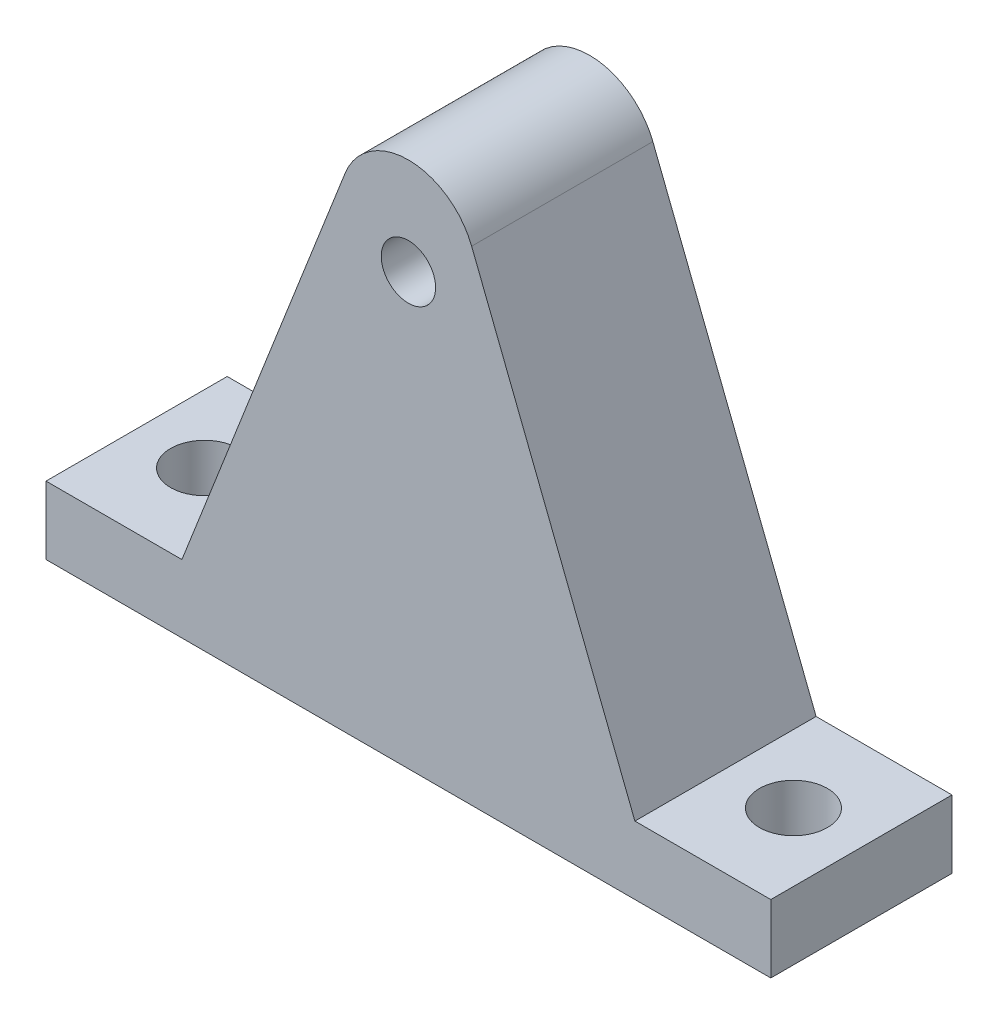
ISO-10303-21;
HEADER;
FILE_DESCRIPTION(('STEP AP214'),'2;1');
FILE_NAME('part.step','',(''),(''),'','','');
FILE_SCHEMA(('AUTOMOTIVE_DESIGN { 1 0 10303 214 1 1 1 1 }'));
ENDSEC;
DATA;
#1=APPLICATION_CONTEXT('core data for automotive mechanical design processes');
#2=APPLICATION_PROTOCOL_DEFINITION('international standard','automotive_design',2000,#1);
#3=PRODUCT_CONTEXT('',#1,'mechanical');
#4=PRODUCT('Part','Part','',(#3));
#5=PRODUCT_RELATED_PRODUCT_CATEGORY('part','',(#4));
#6=PRODUCT_DEFINITION_FORMATION('','',#4);
#7=PRODUCT_DEFINITION_CONTEXT('part definition',#1,'design');
#8=PRODUCT_DEFINITION('design','',#6,#7);
#9=PRODUCT_DEFINITION_SHAPE('','',#8);
#10=(LENGTH_UNIT() NAMED_UNIT(*) SI_UNIT(.MILLI.,.METRE.));
#11=(NAMED_UNIT(*) PLANE_ANGLE_UNIT() SI_UNIT($,.RADIAN.));
#12=(NAMED_UNIT(*) SI_UNIT($,.STERADIAN.) SOLID_ANGLE_UNIT());
#13=UNCERTAINTY_MEASURE_WITH_UNIT(LENGTH_MEASURE(1.E-05),#10,'distance_accuracy_value','');
#14=(GEOMETRIC_REPRESENTATION_CONTEXT(3) GLOBAL_UNCERTAINTY_ASSIGNED_CONTEXT((#13)) GLOBAL_UNIT_ASSIGNED_CONTEXT((#10,
#11,#12)) REPRESENTATION_CONTEXT('',''));
#15=CARTESIAN_POINT('',(0.,0.,0.));
#16=DIRECTION('',(0.,0.,1.));
#17=DIRECTION('',(1.,0.,0.));
#18=AXIS2_PLACEMENT_3D('',#15,#16,#17);
#19=CARTESIAN_POINT('',(16.,20.2822654731697,8.));
#20=DIRECTION('',(0.,0.,1.));
#21=DIRECTION('',(1.,0.,0.));
#22=AXIS2_PLACEMENT_3D('',#19,#20,#21);
#23=PLANE('',#22);
#24=DIRECTION('',(0.,-1.,0.));
#25=VECTOR('',#24,1.);
#26=CARTESIAN_POINT('',(0.,0.,8.));
#27=LINE('',#26,#25);
#28=CARTESIAN_POINT('',(0.,3.,8.));
#29=VERTEX_POINT('',#28);
#30=CARTESIAN_POINT('',(0.,0.,8.));
#31=VERTEX_POINT('',#30);
#32=EDGE_CURVE('E181',#29,#31,#27,.T.);
#33=ORIENTED_EDGE('',*,*,#32,.T.);
#34=DIRECTION('',(1.,0.,0.));
#35=VECTOR('',#34,1.);
#36=CARTESIAN_POINT('',(0.,0.,8.));
#37=LINE('',#36,#35);
#38=CARTESIAN_POINT('',(32.,0.,8.));
#39=VERTEX_POINT('',#38);
#40=EDGE_CURVE('E112',#31,#39,#37,.T.);
#41=ORIENTED_EDGE('',*,*,#40,.T.);
#42=DIRECTION('',(0.,1.,0.));
#43=VECTOR('',#42,1.);
#44=CARTESIAN_POINT('',(32.,0.,8.));
#45=LINE('',#44,#43);
#46=CARTESIAN_POINT('',(32.,3.,8.));
#47=VERTEX_POINT('',#46);
#48=EDGE_CURVE('E203',#39,#47,#45,.T.);
#49=ORIENTED_EDGE('',*,*,#48,.T.);
#50=DIRECTION('',(-1.,0.,0.));
#51=VECTOR('',#50,1.);
#52=CARTESIAN_POINT('',(32.,3.,8.));
#53=LINE('',#52,#51);
#54=CARTESIAN_POINT('',(26.,3.,8.));
#55=VERTEX_POINT('',#54);
#56=EDGE_CURVE('E217',#47,#55,#53,.T.);
#57=ORIENTED_EDGE('',*,*,#56,.T.);
#58=DIRECTION('',(-0.365096602195257,0.930969640249067,0.));
#59=VECTOR('',#58,1.);
#60=CARTESIAN_POINT('',(18.7929089207472,21.3775552797555,8.));
#61=LINE('',#60,#59);
#62=CARTESIAN_POINT('',(18.7929089207472,21.3775552797555,8.));
#63=VERTEX_POINT('',#62);
#64=EDGE_CURVE('E135',#55,#63,#61,.T.);
#65=ORIENTED_EDGE('',*,*,#64,.T.);
#66=CARTESIAN_POINT('',(16.,20.2822654731697,8.));
#67=DIRECTION('',(0.,0.,1.));
#68=DIRECTION('',(1.,0.,0.));
#69=AXIS2_PLACEMENT_3D('',#66,#67,#68);
#70=CIRCLE('',#69,3.);
#71=CARTESIAN_POINT('',(13.2070910792528,21.3775552797555,8.));
#72=VERTEX_POINT('',#71);
#73=EDGE_CURVE('E129',#63,#72,#70,.T.);
#74=ORIENTED_EDGE('',*,*,#73,.T.);
#75=DIRECTION('',(-0.365096602195257,-0.930969640249068,0.));
#76=VECTOR('',#75,1.);
#77=CARTESIAN_POINT('',(13.2070910792528,21.3775552797555,8.));
#78=LINE('',#77,#76);
#79=CARTESIAN_POINT('',(6.,3.,8.));
#80=VERTEX_POINT('',#79);
#81=EDGE_CURVE('E133',#72,#80,#78,.T.);
#82=ORIENTED_EDGE('',*,*,#81,.T.);
#83=DIRECTION('',(-1.,0.,0.));
#84=VECTOR('',#83,1.);
#85=CARTESIAN_POINT('',(0.,3.,8.));
#86=LINE('',#85,#84);
#87=EDGE_CURVE('E60',#80,#29,#86,.T.);
#88=ORIENTED_EDGE('',*,*,#87,.T.);
#89=EDGE_LOOP('',(#33,#41,#49,#57,#65,#74,#82,#88));
#90=FACE_BOUND('',#89,.T.);
#91=CARTESIAN_POINT('',(16.,19.,8.));
#92=DIRECTION('',(0.,0.,1.));
#93=DIRECTION('',(1.,0.,0.));
#94=AXIS2_PLACEMENT_3D('',#91,#92,#93);
#95=CIRCLE('',#94,1.2);
#96=CARTESIAN_POINT('',(17.2,19.,8.));
#97=VERTEX_POINT('',#96);
#98=EDGE_CURVE('E164',#97,#97,#95,.T.);
#99=ORIENTED_EDGE('',*,*,#98,.F.);
#100=EDGE_LOOP('',(#99));
#101=FACE_BOUND('',#100,.T.);
#102=ADVANCED_FACE('F39',(#90,#101),#23,.T.);
#103=CARTESIAN_POINT('',(16.,20.2822654731697,0.));
#104=DIRECTION('',(0.,0.,1.));
#105=DIRECTION('',(1.,0.,0.));
#106=AXIS2_PLACEMENT_3D('',#103,#104,#105);
#107=PLANE('',#106);
#108=DIRECTION('',(0.,-1.,0.));
#109=VECTOR('',#108,1.);
#110=CARTESIAN_POINT('',(0.,0.,0.));
#111=LINE('',#110,#109);
#112=CARTESIAN_POINT('',(0.,3.,0.));
#113=VERTEX_POINT('',#112);
#114=CARTESIAN_POINT('',(0.,0.,0.));
#115=VERTEX_POINT('',#114);
#116=EDGE_CURVE('E159',#113,#115,#111,.T.);
#117=ORIENTED_EDGE('',*,*,#116,.F.);
#118=DIRECTION('',(-1.,0.,0.));
#119=VECTOR('',#118,1.);
#120=CARTESIAN_POINT('',(0.,3.,0.));
#121=LINE('',#120,#119);
#122=CARTESIAN_POINT('',(6.,3.,0.));
#123=VERTEX_POINT('',#122);
#124=EDGE_CURVE('E103',#123,#113,#121,.T.);
#125=ORIENTED_EDGE('',*,*,#124,.F.);
#126=DIRECTION('',(-0.365096602195257,-0.930969640249068,0.));
#127=VECTOR('',#126,1.);
#128=CARTESIAN_POINT('',(13.2070910792528,21.3775552797555,0.));
#129=LINE('',#128,#127);
#130=CARTESIAN_POINT('',(13.2070910792528,21.3775552797555,0.));
#131=VERTEX_POINT('',#130);
#132=EDGE_CURVE('E96',#131,#123,#129,.T.);
#133=ORIENTED_EDGE('',*,*,#132,.F.);
#134=CARTESIAN_POINT('',(16.,20.2822654731697,0.));
#135=DIRECTION('',(0.,0.,1.));
#136=DIRECTION('',(1.,0.,0.));
#137=AXIS2_PLACEMENT_3D('',#134,#135,#136);
#138=CIRCLE('',#137,3.);
#139=CARTESIAN_POINT('',(18.7929089207472,21.3775552797555,0.));
#140=VERTEX_POINT('',#139);
#141=EDGE_CURVE('E144',#140,#131,#138,.T.);
#142=ORIENTED_EDGE('',*,*,#141,.F.);
#143=DIRECTION('',(-0.365096602195257,0.930969640249067,0.));
#144=VECTOR('',#143,1.);
#145=CARTESIAN_POINT('',(18.7929089207472,21.3775552797555,0.));
#146=LINE('',#145,#144);
#147=CARTESIAN_POINT('',(26.,3.,0.));
#148=VERTEX_POINT('',#147);
#149=EDGE_CURVE('E173',#148,#140,#146,.T.);
#150=ORIENTED_EDGE('',*,*,#149,.F.);
#151=DIRECTION('',(-1.,0.,0.));
#152=VECTOR('',#151,1.);
#153=CARTESIAN_POINT('',(32.,3.,0.));
#154=LINE('',#153,#152);
#155=CARTESIAN_POINT('',(32.,3.,0.));
#156=VERTEX_POINT('',#155);
#157=EDGE_CURVE('E170',#156,#148,#154,.T.);
#158=ORIENTED_EDGE('',*,*,#157,.F.);
#159=DIRECTION('',(0.,1.,0.));
#160=VECTOR('',#159,1.);
#161=CARTESIAN_POINT('',(32.,0.,0.));
#162=LINE('',#161,#160);
#163=CARTESIAN_POINT('',(32.,0.,0.));
#164=VERTEX_POINT('',#163);
#165=EDGE_CURVE('E167',#164,#156,#162,.T.);
#166=ORIENTED_EDGE('',*,*,#165,.F.);
#167=DIRECTION('',(1.,0.,0.));
#168=VECTOR('',#167,1.);
#169=CARTESIAN_POINT('',(0.,0.,0.));
#170=LINE('',#169,#168);
#171=EDGE_CURVE('E163',#115,#164,#170,.T.);
#172=ORIENTED_EDGE('',*,*,#171,.F.);
#173=EDGE_LOOP('',(#117,#125,#133,#142,#150,#158,#166,#172));
#174=FACE_BOUND('',#173,.T.);
#175=CARTESIAN_POINT('',(16.,19.,0.));
#176=DIRECTION('',(0.,0.,1.));
#177=DIRECTION('',(1.,0.,0.));
#178=AXIS2_PLACEMENT_3D('',#175,#176,#177);
#179=CIRCLE('',#178,1.2);
#180=CARTESIAN_POINT('',(17.2,19.,0.));
#181=VERTEX_POINT('',#180);
#182=EDGE_CURVE('E228',#181,#181,#179,.T.);
#183=ORIENTED_EDGE('',*,*,#182,.T.);
#184=EDGE_LOOP('',(#183));
#185=FACE_BOUND('',#184,.T.);
#186=ADVANCED_FACE('F207',(#174,#185),#107,.F.);
#187=CARTESIAN_POINT('',(0.,0.,8.));
#188=DIRECTION('',(1.,0.,0.));
#189=DIRECTION('',(0.,0.,-1.));
#190=AXIS2_PLACEMENT_3D('',#187,#188,#189);
#191=PLANE('',#190);
#192=ORIENTED_EDGE('',*,*,#116,.T.);
#193=DIRECTION('',(0.,0.,-1.));
#194=VECTOR('',#193,1.);
#195=CARTESIAN_POINT('',(0.,0.,8.));
#196=LINE('',#195,#194);
#197=EDGE_CURVE('E11',#31,#115,#196,.T.);
#198=ORIENTED_EDGE('',*,*,#197,.F.);
#199=ORIENTED_EDGE('',*,*,#32,.F.);
#200=DIRECTION('',(0.,0.,-1.));
#201=VECTOR('',#200,1.);
#202=CARTESIAN_POINT('',(0.,3.,8.));
#203=LINE('',#202,#201);
#204=EDGE_CURVE('E155',#29,#113,#203,.T.);
#205=ORIENTED_EDGE('',*,*,#204,.T.);
#206=EDGE_LOOP('',(#192,#198,#199,#205));
#207=FACE_BOUND('',#206,.T.);
#208=ADVANCED_FACE('F41',(#207),#191,.F.);
#209=CARTESIAN_POINT('',(0.,0.,8.));
#210=DIRECTION('',(0.,1.,0.));
#211=DIRECTION('',(-1.,0.,0.));
#212=AXIS2_PLACEMENT_3D('',#209,#210,#211);
#213=PLANE('',#212);
#214=CARTESIAN_POINT('',(29.,0.,4.));
#215=DIRECTION('',(0.,1.,0.));
#216=DIRECTION('',(1.,0.,0.));
#217=AXIS2_PLACEMENT_3D('',#214,#215,#216);
#218=CIRCLE('',#217,1.5);
#219=CARTESIAN_POINT('',(30.5,0.,4.));
#220=VERTEX_POINT('',#219);
#221=EDGE_CURVE('E239',#220,#220,#218,.T.);
#222=ORIENTED_EDGE('',*,*,#221,.T.);
#223=EDGE_LOOP('',(#222));
#224=FACE_BOUND('',#223,.T.);
#225=CARTESIAN_POINT('',(3.,0.,4.));
#226=DIRECTION('',(0.,1.,0.));
#227=DIRECTION('',(-1.,0.,0.));
#228=AXIS2_PLACEMENT_3D('',#225,#226,#227);
#229=CIRCLE('',#228,1.5);
#230=CARTESIAN_POINT('',(1.5,0.,4.));
#231=VERTEX_POINT('',#230);
#232=EDGE_CURVE('E232',#231,#231,#229,.T.);
#233=ORIENTED_EDGE('',*,*,#232,.T.);
#234=EDGE_LOOP('',(#233));
#235=FACE_BOUND('',#234,.T.);
#236=ORIENTED_EDGE('',*,*,#171,.T.);
#237=DIRECTION('',(0.,0.,-1.));
#238=VECTOR('',#237,1.);
#239=CARTESIAN_POINT('',(32.,0.,8.));
#240=LINE('',#239,#238);
#241=EDGE_CURVE('E49',#39,#164,#240,.T.);
#242=ORIENTED_EDGE('',*,*,#241,.F.);
#243=ORIENTED_EDGE('',*,*,#40,.F.);
#244=ORIENTED_EDGE('',*,*,#197,.T.);
#245=EDGE_LOOP('',(#236,#242,#243,#244));
#246=FACE_BOUND('',#245,.T.);
#247=ADVANCED_FACE('F249',(#224,#235,#246),#213,.F.);
#248=CARTESIAN_POINT('',(32.,0.,8.));
#249=DIRECTION('',(-1.,0.,0.));
#250=DIRECTION('',(0.,0.,1.));
#251=AXIS2_PLACEMENT_3D('',#248,#249,#250);
#252=PLANE('',#251);
#253=ORIENTED_EDGE('',*,*,#165,.T.);
#254=DIRECTION('',(0.,0.,-1.));
#255=VECTOR('',#254,1.);
#256=CARTESIAN_POINT('',(32.,3.,8.));
#257=LINE('',#256,#255);
#258=EDGE_CURVE('E192',#47,#156,#257,.T.);
#259=ORIENTED_EDGE('',*,*,#258,.F.);
#260=ORIENTED_EDGE('',*,*,#48,.F.);
#261=ORIENTED_EDGE('',*,*,#241,.T.);
#262=EDGE_LOOP('',(#253,#259,#260,#261));
#263=FACE_BOUND('',#262,.T.);
#264=ADVANCED_FACE('F201',(#263),#252,.F.);
#265=CARTESIAN_POINT('',(32.,3.,8.));
#266=DIRECTION('',(0.,-1.,0.));
#267=DIRECTION('',(1.,0.,0.));
#268=AXIS2_PLACEMENT_3D('',#265,#266,#267);
#269=PLANE('',#268);
#270=CARTESIAN_POINT('',(29.,3.,4.));
#271=DIRECTION('',(0.,1.,0.));
#272=DIRECTION('',(1.,0.,0.));
#273=AXIS2_PLACEMENT_3D('',#270,#271,#272);
#274=CIRCLE('',#273,1.5);
#275=CARTESIAN_POINT('',(30.5,3.,4.));
#276=VERTEX_POINT('',#275);
#277=EDGE_CURVE('E243',#276,#276,#274,.T.);
#278=ORIENTED_EDGE('',*,*,#277,.F.);
#279=EDGE_LOOP('',(#278));
#280=FACE_BOUND('',#279,.T.);
#281=ORIENTED_EDGE('',*,*,#157,.T.);
#282=DIRECTION('',(0.,0.,-1.));
#283=VECTOR('',#282,1.);
#284=CARTESIAN_POINT('',(26.,3.,8.));
#285=LINE('',#284,#283);
#286=EDGE_CURVE('E188',#55,#148,#285,.T.);
#287=ORIENTED_EDGE('',*,*,#286,.F.);
#288=ORIENTED_EDGE('',*,*,#56,.F.);
#289=ORIENTED_EDGE('',*,*,#258,.T.);
#290=EDGE_LOOP('',(#281,#287,#288,#289));
#291=FACE_BOUND('',#290,.T.);
#292=ADVANCED_FACE('F212',(#280,#291),#269,.F.);
#293=CARTESIAN_POINT('',(18.7929089207472,21.3775552797555,8.));
#294=DIRECTION('',(-0.930969640249068,-0.365096602195257,0.));
#295=DIRECTION('',(0.365096602195257,-0.930969640249068,0.));
#296=AXIS2_PLACEMENT_3D('',#293,#294,#295);
#297=PLANE('',#296);
#298=ORIENTED_EDGE('',*,*,#149,.T.);
#299=DIRECTION('',(0.,0.,-1.));
#300=VECTOR('',#299,1.);
#301=CARTESIAN_POINT('',(18.7929089207472,21.3775552797555,8.));
#302=LINE('',#301,#300);
#303=EDGE_CURVE('E146',#63,#140,#302,.T.);
#304=ORIENTED_EDGE('',*,*,#303,.F.);
#305=ORIENTED_EDGE('',*,*,#64,.F.);
#306=ORIENTED_EDGE('',*,*,#286,.T.);
#307=EDGE_LOOP('',(#298,#304,#305,#306));
#308=FACE_BOUND('',#307,.T.);
#309=ADVANCED_FACE('F215',(#308),#297,.F.);
#310=CARTESIAN_POINT('',(16.,20.2822654731697,8.));
#311=DIRECTION('',(0.,0.,-1.));
#312=DIRECTION('',(-1.,0.,0.));
#313=AXIS2_PLACEMENT_3D('',#310,#311,#312);
#314=CYLINDRICAL_SURFACE('',#313,3.);
#315=ORIENTED_EDGE('',*,*,#141,.T.);
#316=DIRECTION('',(0.,0.,-1.));
#317=VECTOR('',#316,1.);
#318=CARTESIAN_POINT('',(13.2070910792528,21.3775552797555,8.));
#319=LINE('',#318,#317);
#320=EDGE_CURVE('E141',#72,#131,#319,.T.);
#321=ORIENTED_EDGE('',*,*,#320,.F.);
#322=ORIENTED_EDGE('',*,*,#73,.F.);
#323=ORIENTED_EDGE('',*,*,#303,.T.);
#324=EDGE_LOOP('',(#315,#321,#322,#323));
#325=FACE_BOUND('',#324,.T.);
#326=ADVANCED_FACE('F142',(#325),#314,.T.);
#327=CARTESIAN_POINT('',(13.2070910792528,21.3775552797555,8.));
#328=DIRECTION('',(0.930969640249068,-0.365096602195257,0.));
#329=DIRECTION('',(0.365096602195257,0.930969640249068,0.));
#330=AXIS2_PLACEMENT_3D('',#327,#328,#329);
#331=PLANE('',#330);
#332=ORIENTED_EDGE('',*,*,#132,.T.);
#333=DIRECTION('',(0.,0.,-1.));
#334=VECTOR('',#333,1.);
#335=CARTESIAN_POINT('',(6.,3.,8.));
#336=LINE('',#335,#334);
#337=EDGE_CURVE('E147',#80,#123,#336,.T.);
#338=ORIENTED_EDGE('',*,*,#337,.F.);
#339=ORIENTED_EDGE('',*,*,#81,.F.);
#340=ORIENTED_EDGE('',*,*,#320,.T.);
#341=EDGE_LOOP('',(#332,#338,#339,#340));
#342=FACE_BOUND('',#341,.T.);
#343=ADVANCED_FACE('F149',(#342),#331,.F.);
#344=CARTESIAN_POINT('',(0.,3.,8.));
#345=DIRECTION('',(0.,-1.,0.));
#346=DIRECTION('',(1.,0.,0.));
#347=AXIS2_PLACEMENT_3D('',#344,#345,#346);
#348=PLANE('',#347);
#349=CARTESIAN_POINT('',(3.,3.,4.));
#350=DIRECTION('',(0.,1.,0.));
#351=DIRECTION('',(-1.,0.,0.));
#352=AXIS2_PLACEMENT_3D('',#349,#350,#351);
#353=CIRCLE('',#352,1.5);
#354=CARTESIAN_POINT('',(1.5,3.,4.));
#355=VERTEX_POINT('',#354);
#356=EDGE_CURVE('E235',#355,#355,#353,.T.);
#357=ORIENTED_EDGE('',*,*,#356,.F.);
#358=EDGE_LOOP('',(#357));
#359=FACE_BOUND('',#358,.T.);
#360=ORIENTED_EDGE('',*,*,#124,.T.);
#361=ORIENTED_EDGE('',*,*,#204,.F.);
#362=ORIENTED_EDGE('',*,*,#87,.F.);
#363=ORIENTED_EDGE('',*,*,#337,.T.);
#364=EDGE_LOOP('',(#360,#361,#362,#363));
#365=FACE_BOUND('',#364,.T.);
#366=ADVANCED_FACE('F277',(#359,#365),#348,.F.);
#367=CARTESIAN_POINT('',(16.,19.,8.));
#368=DIRECTION('',(0.,0.,-1.));
#369=DIRECTION('',(-1.,0.,0.));
#370=AXIS2_PLACEMENT_3D('',#367,#368,#369);
#371=CYLINDRICAL_SURFACE('',#370,1.2);
#372=ORIENTED_EDGE('',*,*,#98,.T.);
#373=EDGE_LOOP('',(#372));
#374=FACE_BOUND('',#373,.T.);
#375=ORIENTED_EDGE('',*,*,#182,.F.);
#376=EDGE_LOOP('',(#375));
#377=FACE_BOUND('',#376,.T.);
#378=ADVANCED_FACE('F274',(#374,#377),#371,.F.);
#379=CARTESIAN_POINT('',(3.,0.,4.));
#380=DIRECTION('',(0.,1.,0.));
#381=DIRECTION('',(-1.,0.,0.));
#382=AXIS2_PLACEMENT_3D('',#379,#380,#381);
#383=CYLINDRICAL_SURFACE('',#382,1.5);
#384=ORIENTED_EDGE('',*,*,#232,.F.);
#385=EDGE_LOOP('',(#384));
#386=FACE_BOUND('',#385,.T.);
#387=ORIENTED_EDGE('',*,*,#356,.T.);
#388=EDGE_LOOP('',(#387));
#389=FACE_BOUND('',#388,.T.);
#390=ADVANCED_FACE('F255',(#386,#389),#383,.F.);
#391=CARTESIAN_POINT('',(29.,0.,4.));
#392=DIRECTION('',(0.,1.,0.));
#393=DIRECTION('',(-1.,0.,0.));
#394=AXIS2_PLACEMENT_3D('',#391,#392,#393);
#395=CYLINDRICAL_SURFACE('',#394,1.5);
#396=ORIENTED_EDGE('',*,*,#221,.F.);
#397=EDGE_LOOP('',(#396));
#398=FACE_BOUND('',#397,.T.);
#399=ORIENTED_EDGE('',*,*,#277,.T.);
#400=EDGE_LOOP('',(#399));
#401=FACE_BOUND('',#400,.T.);
#402=ADVANCED_FACE('F252',(#398,#401),#395,.F.);
#403=CLOSED_SHELL('',(#102,#186,#208,#247,#264,#292,#309,#326,#343,#366,#378,#390,#402));
#404=MANIFOLD_SOLID_BREP('B2',#403);
#405=ADVANCED_BREP_SHAPE_REPRESENTATION('',(#18,#404),#14);
#406=SHAPE_DEFINITION_REPRESENTATION(#9,#405);
ENDSEC;
END-ISO-10303-21;
